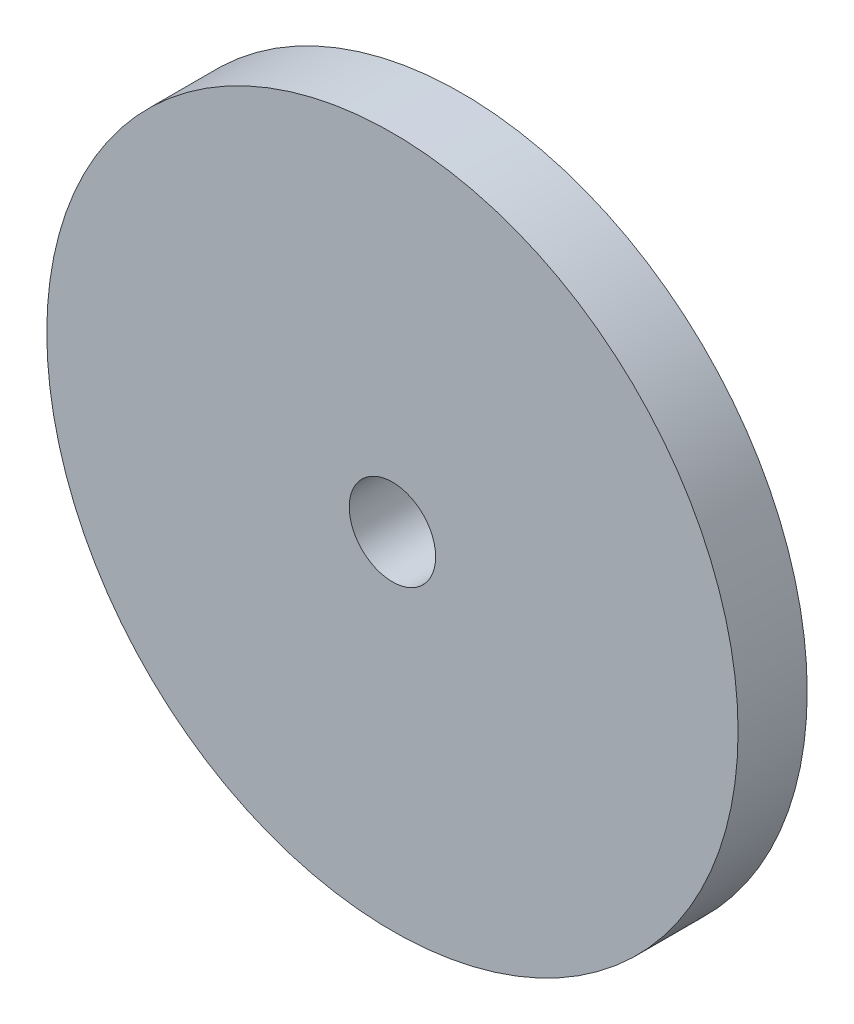
ISO-10303-21;
HEADER;
FILE_DESCRIPTION(('STEP AP214'),'2;1');
FILE_NAME('part.step','',(''),(''),'','','');
FILE_SCHEMA(('AUTOMOTIVE_DESIGN { 1 0 10303 214 1 1 1 1 }'));
ENDSEC;
DATA;
#1=APPLICATION_CONTEXT('core data for automotive mechanical design processes');
#2=APPLICATION_PROTOCOL_DEFINITION('international standard','automotive_design',2000,#1);
#3=PRODUCT_CONTEXT('',#1,'mechanical');
#4=PRODUCT('Part','Part','',(#3));
#5=PRODUCT_RELATED_PRODUCT_CATEGORY('part','',(#4));
#6=PRODUCT_DEFINITION_FORMATION('','',#4);
#7=PRODUCT_DEFINITION_CONTEXT('part definition',#1,'design');
#8=PRODUCT_DEFINITION('design','',#6,#7);
#9=PRODUCT_DEFINITION_SHAPE('','',#8);
#10=(LENGTH_UNIT() NAMED_UNIT(*) SI_UNIT(.MILLI.,.METRE.));
#11=(NAMED_UNIT(*) PLANE_ANGLE_UNIT() SI_UNIT($,.RADIAN.));
#12=(NAMED_UNIT(*) SI_UNIT($,.STERADIAN.) SOLID_ANGLE_UNIT());
#13=UNCERTAINTY_MEASURE_WITH_UNIT(LENGTH_MEASURE(1.E-05),#10,'distance_accuracy_value','');
#14=(GEOMETRIC_REPRESENTATION_CONTEXT(3) GLOBAL_UNCERTAINTY_ASSIGNED_CONTEXT((#13)) GLOBAL_UNIT_ASSIGNED_CONTEXT((#10,
#11,#12)) REPRESENTATION_CONTEXT('',''));
#15=CARTESIAN_POINT('',(0.,0.,0.));
#16=DIRECTION('',(0.,0.,1.));
#17=DIRECTION('',(1.,0.,0.));
#18=AXIS2_PLACEMENT_3D('',#15,#16,#17);
#19=CARTESIAN_POINT('',(0.,0.,4.));
#20=DIRECTION('',(0.,0.,-1.));
#21=DIRECTION('',(-1.,0.,0.));
#22=AXIS2_PLACEMENT_3D('',#19,#20,#21);
#23=CYLINDRICAL_SURFACE('',#22,20.);
#24=CARTESIAN_POINT('',(0.,0.,4.));
#25=DIRECTION('',(0.,0.,1.));
#26=DIRECTION('',(1.,0.,0.));
#27=AXIS2_PLACEMENT_3D('',#24,#25,#26);
#28=CIRCLE('',#27,20.);
#29=CARTESIAN_POINT('',(20.,0.,4.));
#30=VERTEX_POINT('',#29);
#31=EDGE_CURVE('E10',#30,#30,#28,.T.);
#32=ORIENTED_EDGE('',*,*,#31,.F.);
#33=EDGE_LOOP('',(#32));
#34=FACE_BOUND('',#33,.T.);
#35=CARTESIAN_POINT('',(0.,0.,0.));
#36=DIRECTION('',(0.,0.,1.));
#37=DIRECTION('',(1.,0.,0.));
#38=AXIS2_PLACEMENT_3D('',#35,#36,#37);
#39=CIRCLE('',#38,20.);
#40=CARTESIAN_POINT('',(20.,0.,0.));
#41=VERTEX_POINT('',#40);
#42=EDGE_CURVE('E43',#41,#41,#39,.T.);
#43=ORIENTED_EDGE('',*,*,#42,.T.);
#44=EDGE_LOOP('',(#43));
#45=FACE_BOUND('',#44,.T.);
#46=ADVANCED_FACE('F40',(#34,#45),#23,.T.);
#47=CARTESIAN_POINT('',(0.,0.,4.));
#48=DIRECTION('',(0.,0.,1.));
#49=DIRECTION('',(1.,0.,0.));
#50=AXIS2_PLACEMENT_3D('',#47,#48,#49);
#51=PLANE('',#50);
#52=CARTESIAN_POINT('',(0.,0.,4.));
#53=DIRECTION('',(0.,0.,1.));
#54=DIRECTION('',(1.,0.,0.));
#55=AXIS2_PLACEMENT_3D('',#52,#53,#54);
#56=CIRCLE('',#55,2.5);
#57=CARTESIAN_POINT('',(2.5,0.,4.));
#58=VERTEX_POINT('',#57);
#59=EDGE_CURVE('E54',#58,#58,#56,.T.);
#60=ORIENTED_EDGE('',*,*,#59,.F.);
#61=EDGE_LOOP('',(#60));
#62=FACE_BOUND('',#61,.T.);
#63=ORIENTED_EDGE('',*,*,#31,.T.);
#64=EDGE_LOOP('',(#63));
#65=FACE_BOUND('',#64,.T.);
#66=ADVANCED_FACE('F71',(#62,#65),#51,.T.);
#67=CARTESIAN_POINT('',(0.,0.,0.));
#68=DIRECTION('',(0.,0.,1.));
#69=DIRECTION('',(1.,0.,0.));
#70=AXIS2_PLACEMENT_3D('',#67,#68,#69);
#71=PLANE('',#70);
#72=CARTESIAN_POINT('',(0.,0.,0.));
#73=DIRECTION('',(0.,0.,1.));
#74=DIRECTION('',(1.,0.,0.));
#75=AXIS2_PLACEMENT_3D('',#72,#73,#74);
#76=CIRCLE('',#75,2.5);
#77=CARTESIAN_POINT('',(2.5,0.,0.));
#78=VERTEX_POINT('',#77);
#79=EDGE_CURVE('E52',#78,#78,#76,.T.);
#80=ORIENTED_EDGE('',*,*,#79,.T.);
#81=EDGE_LOOP('',(#80));
#82=FACE_BOUND('',#81,.T.);
#83=ORIENTED_EDGE('',*,*,#42,.F.);
#84=EDGE_LOOP('',(#83));
#85=FACE_BOUND('',#84,.T.);
#86=ADVANCED_FACE('F62',(#82,#85),#71,.F.);
#87=CARTESIAN_POINT('',(0.,0.,0.));
#88=DIRECTION('',(0.,0.,1.));
#89=DIRECTION('',(1.,0.,0.));
#90=AXIS2_PLACEMENT_3D('',#87,#88,#89);
#91=CYLINDRICAL_SURFACE('',#90,2.5);
#92=ORIENTED_EDGE('',*,*,#79,.F.);
#93=EDGE_LOOP('',(#92));
#94=FACE_BOUND('',#93,.T.);
#95=ORIENTED_EDGE('',*,*,#59,.T.);
#96=EDGE_LOOP('',(#95));
#97=FACE_BOUND('',#96,.T.);
#98=ADVANCED_FACE('F65',(#94,#97),#91,.F.);
#99=CLOSED_SHELL('',(#46,#66,#86,#98));
#100=MANIFOLD_SOLID_BREP('B2',#99);
#101=ADVANCED_BREP_SHAPE_REPRESENTATION('',(#18,#100),#14);
#102=SHAPE_DEFINITION_REPRESENTATION(#9,#101);
ENDSEC;
END-ISO-10303-21;
